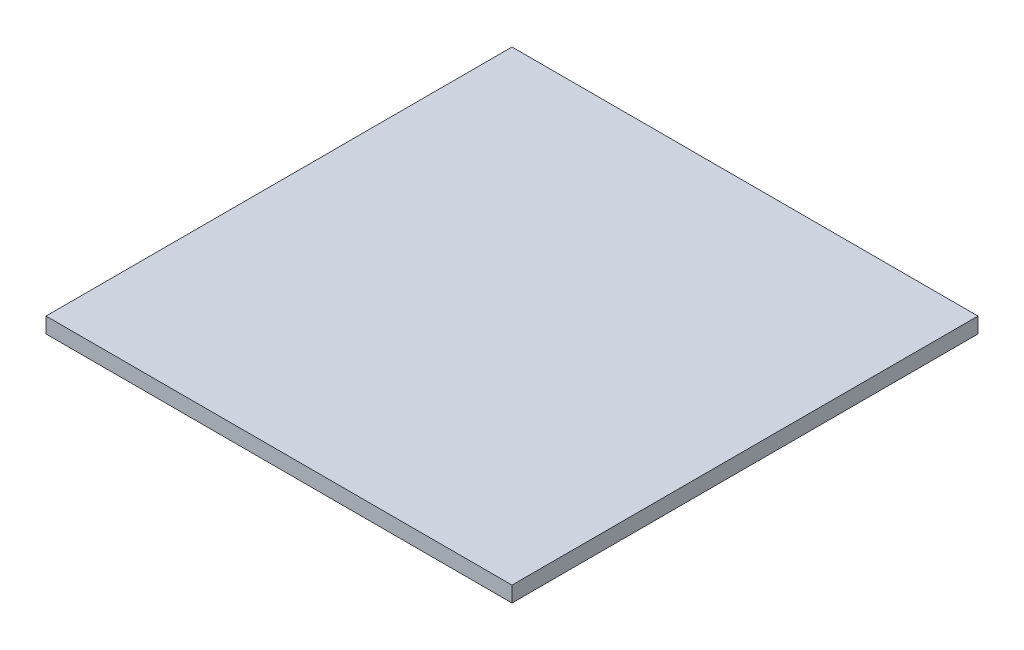
ISO-10303-21;
HEADER;
FILE_DESCRIPTION(('STEP AP214'),'2;1');
FILE_NAME('part.step','',(''),(''),'','','');
FILE_SCHEMA(('AUTOMOTIVE_DESIGN { 1 0 10303 214 1 1 1 1 }'));
ENDSEC;
DATA;
#1=APPLICATION_CONTEXT('core data for automotive mechanical design processes');
#2=APPLICATION_PROTOCOL_DEFINITION('international standard','automotive_design',2000,#1);
#3=PRODUCT_CONTEXT('',#1,'mechanical');
#4=PRODUCT('Part','Part','',(#3));
#5=PRODUCT_RELATED_PRODUCT_CATEGORY('part','',(#4));
#6=PRODUCT_DEFINITION_FORMATION('','',#4);
#7=PRODUCT_DEFINITION_CONTEXT('part definition',#1,'design');
#8=PRODUCT_DEFINITION('design','',#6,#7);
#9=PRODUCT_DEFINITION_SHAPE('','',#8);
#10=(LENGTH_UNIT() NAMED_UNIT(*) SI_UNIT(.MILLI.,.METRE.));
#11=(NAMED_UNIT(*) PLANE_ANGLE_UNIT() SI_UNIT($,.RADIAN.));
#12=(NAMED_UNIT(*) SI_UNIT($,.STERADIAN.) SOLID_ANGLE_UNIT());
#13=UNCERTAINTY_MEASURE_WITH_UNIT(LENGTH_MEASURE(1.E-05),#10,'distance_accuracy_value','');
#14=(GEOMETRIC_REPRESENTATION_CONTEXT(3) GLOBAL_UNCERTAINTY_ASSIGNED_CONTEXT((#13)) GLOBAL_UNIT_ASSIGNED_CONTEXT((#10,
#11,#12)) REPRESENTATION_CONTEXT('',''));
#15=CARTESIAN_POINT('',(0.,0.,0.));
#16=DIRECTION('',(0.,0.,1.));
#17=DIRECTION('',(1.,0.,0.));
#18=AXIS2_PLACEMENT_3D('',#15,#16,#17);
#19=CARTESIAN_POINT('',(0.,2.54,0.));
#20=DIRECTION('',(1.,0.,0.));
#21=DIRECTION('',(0.,0.,-1.));
#22=AXIS2_PLACEMENT_3D('',#19,#20,#21);
#23=PLANE('',#22);
#24=DIRECTION('',(0.,0.,1.));
#25=VECTOR('',#24,1.);
#26=CARTESIAN_POINT('',(0.,0.,0.));
#27=LINE('',#26,#25);
#28=CARTESIAN_POINT('',(0.,0.,-76.2));
#29=VERTEX_POINT('',#28);
#30=CARTESIAN_POINT('',(0.,0.,0.));
#31=VERTEX_POINT('',#30);
#32=EDGE_CURVE('E96',#29,#31,#27,.T.);
#33=ORIENTED_EDGE('',*,*,#32,.T.);
#34=DIRECTION('',(0.,-1.,0.));
#35=VECTOR('',#34,1.);
#36=CARTESIAN_POINT('',(0.,2.54,0.));
#37=LINE('',#36,#35);
#38=CARTESIAN_POINT('',(0.,2.54,0.));
#39=VERTEX_POINT('',#38);
#40=EDGE_CURVE('E11',#39,#31,#37,.T.);
#41=ORIENTED_EDGE('',*,*,#40,.F.);
#42=DIRECTION('',(0.,0.,1.));
#43=VECTOR('',#42,1.);
#44=CARTESIAN_POINT('',(0.,2.54,0.));
#45=LINE('',#44,#43);
#46=CARTESIAN_POINT('',(0.,2.54,-76.2));
#47=VERTEX_POINT('',#46);
#48=EDGE_CURVE('E84',#47,#39,#45,.T.);
#49=ORIENTED_EDGE('',*,*,#48,.F.);
#50=DIRECTION('',(0.,-1.,0.));
#51=VECTOR('',#50,1.);
#52=CARTESIAN_POINT('',(0.,2.54,-76.2));
#53=LINE('',#52,#51);
#54=EDGE_CURVE('E92',#47,#29,#53,.T.);
#55=ORIENTED_EDGE('',*,*,#54,.T.);
#56=EDGE_LOOP('',(#33,#41,#49,#55));
#57=FACE_BOUND('',#56,.T.);
#58=ADVANCED_FACE('F33',(#57),#23,.F.);
#59=CARTESIAN_POINT('',(0.,2.54,0.));
#60=DIRECTION('',(0.,0.,-1.));
#61=DIRECTION('',(-1.,0.,0.));
#62=AXIS2_PLACEMENT_3D('',#59,#60,#61);
#63=PLANE('',#62);
#64=DIRECTION('',(1.,0.,0.));
#65=VECTOR('',#64,1.);
#66=CARTESIAN_POINT('',(0.,0.,0.));
#67=LINE('',#66,#65);
#68=CARTESIAN_POINT('',(76.2,0.,0.));
#69=VERTEX_POINT('',#68);
#70=EDGE_CURVE('E88',#31,#69,#67,.T.);
#71=ORIENTED_EDGE('',*,*,#70,.T.);
#72=DIRECTION('',(0.,-1.,0.));
#73=VECTOR('',#72,1.);
#74=CARTESIAN_POINT('',(76.2,2.54,0.));
#75=LINE('',#74,#73);
#76=CARTESIAN_POINT('',(76.2,2.54,0.));
#77=VERTEX_POINT('',#76);
#78=EDGE_CURVE('E41',#77,#69,#75,.T.);
#79=ORIENTED_EDGE('',*,*,#78,.F.);
#80=DIRECTION('',(1.,0.,0.));
#81=VECTOR('',#80,1.);
#82=CARTESIAN_POINT('',(0.,2.54,0.));
#83=LINE('',#82,#81);
#84=EDGE_CURVE('E79',#39,#77,#83,.T.);
#85=ORIENTED_EDGE('',*,*,#84,.F.);
#86=ORIENTED_EDGE('',*,*,#40,.T.);
#87=EDGE_LOOP('',(#71,#79,#85,#86));
#88=FACE_BOUND('',#87,.T.);
#89=ADVANCED_FACE('F87',(#88),#63,.F.);
#90=CARTESIAN_POINT('',(76.2,2.54,0.));
#91=DIRECTION('',(-1.,0.,0.));
#92=DIRECTION('',(0.,0.,1.));
#93=AXIS2_PLACEMENT_3D('',#90,#91,#92);
#94=PLANE('',#93);
#95=DIRECTION('',(0.,0.,-1.));
#96=VECTOR('',#95,1.);
#97=CARTESIAN_POINT('',(76.2,0.,0.));
#98=LINE('',#97,#96);
#99=CARTESIAN_POINT('',(76.2,0.,-76.2));
#100=VERTEX_POINT('',#99);
#101=EDGE_CURVE('E66',#69,#100,#98,.T.);
#102=ORIENTED_EDGE('',*,*,#101,.T.);
#103=DIRECTION('',(0.,-1.,0.));
#104=VECTOR('',#103,1.);
#105=CARTESIAN_POINT('',(76.2,2.54,-76.2));
#106=LINE('',#105,#104);
#107=CARTESIAN_POINT('',(76.2,2.54,-76.2));
#108=VERTEX_POINT('',#107);
#109=EDGE_CURVE('E89',#108,#100,#106,.T.);
#110=ORIENTED_EDGE('',*,*,#109,.F.);
#111=DIRECTION('',(0.,0.,-1.));
#112=VECTOR('',#111,1.);
#113=CARTESIAN_POINT('',(76.2,2.54,0.));
#114=LINE('',#113,#112);
#115=EDGE_CURVE('E82',#77,#108,#114,.T.);
#116=ORIENTED_EDGE('',*,*,#115,.F.);
#117=ORIENTED_EDGE('',*,*,#78,.T.);
#118=EDGE_LOOP('',(#102,#110,#116,#117));
#119=FACE_BOUND('',#118,.T.);
#120=ADVANCED_FACE('F90',(#119),#94,.F.);
#121=CARTESIAN_POINT('',(0.,2.54,-76.2));
#122=DIRECTION('',(0.,0.,1.));
#123=DIRECTION('',(1.,0.,0.));
#124=AXIS2_PLACEMENT_3D('',#121,#122,#123);
#125=PLANE('',#124);
#126=DIRECTION('',(-1.,0.,0.));
#127=VECTOR('',#126,1.);
#128=CARTESIAN_POINT('',(0.,0.,-76.2));
#129=LINE('',#128,#127);
#130=EDGE_CURVE('E72',#100,#29,#129,.T.);
#131=ORIENTED_EDGE('',*,*,#130,.T.);
#132=ORIENTED_EDGE('',*,*,#54,.F.);
#133=DIRECTION('',(-1.,0.,0.));
#134=VECTOR('',#133,1.);
#135=CARTESIAN_POINT('',(0.,2.54,-76.2));
#136=LINE('',#135,#134);
#137=EDGE_CURVE('E49',#108,#47,#136,.T.);
#138=ORIENTED_EDGE('',*,*,#137,.F.);
#139=ORIENTED_EDGE('',*,*,#109,.T.);
#140=EDGE_LOOP('',(#131,#132,#138,#139));
#141=FACE_BOUND('',#140,.T.);
#142=ADVANCED_FACE('F103',(#141),#125,.F.);
#143=CARTESIAN_POINT('',(0.,2.54,0.));
#144=DIRECTION('',(0.,-1.,0.));
#145=DIRECTION('',(0.,0.,-1.));
#146=AXIS2_PLACEMENT_3D('',#143,#144,#145);
#147=PLANE('',#146);
#148=ORIENTED_EDGE('',*,*,#48,.T.);
#149=ORIENTED_EDGE('',*,*,#84,.T.);
#150=ORIENTED_EDGE('',*,*,#115,.T.);
#151=ORIENTED_EDGE('',*,*,#137,.T.);
#152=EDGE_LOOP('',(#148,#149,#150,#151));
#153=FACE_BOUND('',#152,.T.);
#154=ADVANCED_FACE('F80',(#153),#147,.F.);
#155=CARTESIAN_POINT('',(0.,0.,0.));
#156=DIRECTION('',(0.,-1.,0.));
#157=DIRECTION('',(0.,0.,-1.));
#158=AXIS2_PLACEMENT_3D('',#155,#156,#157);
#159=PLANE('',#158);
#160=ORIENTED_EDGE('',*,*,#32,.F.);
#161=ORIENTED_EDGE('',*,*,#130,.F.);
#162=ORIENTED_EDGE('',*,*,#101,.F.);
#163=ORIENTED_EDGE('',*,*,#70,.F.);
#164=EDGE_LOOP('',(#160,#161,#162,#163));
#165=FACE_BOUND('',#164,.T.);
#166=ADVANCED_FACE('F106',(#165),#159,.T.);
#167=CLOSED_SHELL('',(#58,#89,#120,#142,#154,#166));
#168=MANIFOLD_SOLID_BREP('B2',#167);
#169=ADVANCED_BREP_SHAPE_REPRESENTATION('',(#18,#168),#14);
#170=SHAPE_DEFINITION_REPRESENTATION(#9,#169);
ENDSEC;
END-ISO-10303-21;
